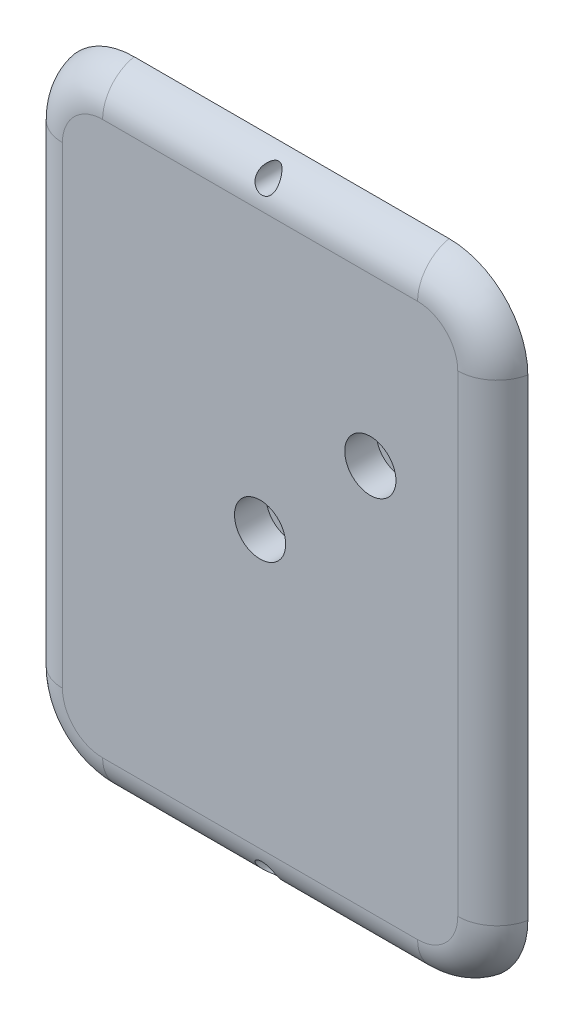
ISO-10303-21;
HEADER;
FILE_DESCRIPTION(('STEP AP214'),'2;1');
FILE_NAME('part.step','',(''),(''),'','','');
FILE_SCHEMA(('AUTOMOTIVE_DESIGN { 1 0 10303 214 1 1 1 1 }'));
ENDSEC;
DATA;
#1=APPLICATION_CONTEXT('core data for automotive mechanical design processes');
#2=APPLICATION_PROTOCOL_DEFINITION('international standard','automotive_design',2000,#1);
#3=PRODUCT_CONTEXT('',#1,'mechanical');
#4=PRODUCT('Part','Part','',(#3));
#5=PRODUCT_RELATED_PRODUCT_CATEGORY('part','',(#4));
#6=PRODUCT_DEFINITION_FORMATION('','',#4);
#7=PRODUCT_DEFINITION_CONTEXT('part definition',#1,'design');
#8=PRODUCT_DEFINITION('design','',#6,#7);
#9=PRODUCT_DEFINITION_SHAPE('','',#8);
#10=(LENGTH_UNIT() NAMED_UNIT(*) SI_UNIT(.MILLI.,.METRE.));
#11=(NAMED_UNIT(*) PLANE_ANGLE_UNIT() SI_UNIT($,.RADIAN.));
#12=(NAMED_UNIT(*) SI_UNIT($,.STERADIAN.) SOLID_ANGLE_UNIT());
#13=UNCERTAINTY_MEASURE_WITH_UNIT(LENGTH_MEASURE(1.E-05),#10,'distance_accuracy_value','');
#14=(GEOMETRIC_REPRESENTATION_CONTEXT(3) GLOBAL_UNCERTAINTY_ASSIGNED_CONTEXT((#13)) GLOBAL_UNIT_ASSIGNED_CONTEXT((#10,
#11,#12)) REPRESENTATION_CONTEXT('',''));
#15=CARTESIAN_POINT('',(0.,0.,0.));
#16=DIRECTION('',(0.,0.,1.));
#17=DIRECTION('',(1.,0.,0.));
#18=AXIS2_PLACEMENT_3D('',#15,#16,#17);
#19=CARTESIAN_POINT('',(20.,-30.,3.));
#20=DIRECTION('',(0.,0.,-1.));
#21=DIRECTION('',(-1.,0.,0.));
#22=AXIS2_PLACEMENT_3D('',#19,#20,#21);
#23=CYLINDRICAL_SURFACE('',#22,5.7);
#24=CARTESIAN_POINT('',(20.,-30.,0.));
#25=DIRECTION('',(0.,0.,1.));
#26=DIRECTION('',(1.,0.,0.));
#27=AXIS2_PLACEMENT_3D('',#24,#25,#26);
#28=CIRCLE('',#27,5.7);
#29=CARTESIAN_POINT('',(20.,-35.7,0.));
#30=VERTEX_POINT('',#29);
#31=CARTESIAN_POINT('',(25.7,-30.,0.));
#32=VERTEX_POINT('',#31);
#33=EDGE_CURVE('E429',#30,#32,#28,.T.);
#34=ORIENTED_EDGE('',*,*,#33,.T.);
#35=DIRECTION('',(0.,0.,-1.));
#36=VECTOR('',#35,1.);
#37=CARTESIAN_POINT('',(25.7,-30.,3.));
#38=LINE('',#37,#36);
#39=CARTESIAN_POINT('',(25.7,-30.,3.));
#40=VERTEX_POINT('',#39);
#41=EDGE_CURVE('E478',#40,#32,#38,.T.);
#42=ORIENTED_EDGE('',*,*,#41,.F.);
#43=CARTESIAN_POINT('',(20.,-30.,3.));
#44=DIRECTION('',(0.,0.,1.));
#45=DIRECTION('',(1.,0.,0.));
#46=AXIS2_PLACEMENT_3D('',#43,#44,#45);
#47=CIRCLE('',#46,5.7);
#48=CARTESIAN_POINT('',(20.,-35.7,3.));
#49=VERTEX_POINT('',#48);
#50=EDGE_CURVE('E457',#49,#40,#47,.T.);
#51=ORIENTED_EDGE('',*,*,#50,.F.);
#52=DIRECTION('',(0.,0.,-1.));
#53=VECTOR('',#52,1.);
#54=CARTESIAN_POINT('',(20.,-35.7,3.));
#55=LINE('',#54,#53);
#56=EDGE_CURVE('E458',#49,#30,#55,.T.);
#57=ORIENTED_EDGE('',*,*,#56,.T.);
#58=EDGE_LOOP('',(#34,#42,#51,#57));
#59=FACE_BOUND('',#58,.T.);
#60=ADVANCED_FACE('F33',(#59),#23,.T.);
#61=CARTESIAN_POINT('',(25.7,-30.,3.));
#62=DIRECTION('',(-1.,0.,0.));
#63=DIRECTION('',(0.,0.,1.));
#64=AXIS2_PLACEMENT_3D('',#61,#62,#63);
#65=PLANE('',#64);
#66=DIRECTION('',(0.,1.,0.));
#67=VECTOR('',#66,1.);
#68=CARTESIAN_POINT('',(25.7,-30.,0.));
#69=LINE('',#68,#67);
#70=CARTESIAN_POINT('',(25.7,30.,0.));
#71=VERTEX_POINT('',#70);
#72=EDGE_CURVE('E433',#32,#71,#69,.T.);
#73=ORIENTED_EDGE('',*,*,#72,.T.);
#74=DIRECTION('',(0.,0.,-1.));
#75=VECTOR('',#74,1.);
#76=CARTESIAN_POINT('',(25.7,30.,3.));
#77=LINE('',#76,#75);
#78=CARTESIAN_POINT('',(25.7,30.,3.));
#79=VERTEX_POINT('',#78);
#80=EDGE_CURVE('E475',#79,#71,#77,.T.);
#81=ORIENTED_EDGE('',*,*,#80,.F.);
#82=DIRECTION('',(0.,1.,0.));
#83=VECTOR('',#82,1.);
#84=CARTESIAN_POINT('',(25.7,-30.,3.));
#85=LINE('',#84,#83);
#86=EDGE_CURVE('E512',#40,#79,#85,.T.);
#87=ORIENTED_EDGE('',*,*,#86,.F.);
#88=ORIENTED_EDGE('',*,*,#41,.T.);
#89=EDGE_LOOP('',(#73,#81,#87,#88));
#90=FACE_BOUND('',#89,.T.);
#91=ADVANCED_FACE('F229',(#90),#65,.F.);
#92=CARTESIAN_POINT('',(20.,30.,3.));
#93=DIRECTION('',(0.,0.,-1.));
#94=DIRECTION('',(-1.,0.,0.));
#95=AXIS2_PLACEMENT_3D('',#92,#93,#94);
#96=CYLINDRICAL_SURFACE('',#95,5.7);
#97=CARTESIAN_POINT('',(20.,30.,0.));
#98=DIRECTION('',(0.,0.,1.));
#99=DIRECTION('',(1.,0.,0.));
#100=AXIS2_PLACEMENT_3D('',#97,#98,#99);
#101=CIRCLE('',#100,5.7);
#102=CARTESIAN_POINT('',(20.,35.7,0.));
#103=VERTEX_POINT('',#102);
#104=EDGE_CURVE('E439',#71,#103,#101,.T.);
#105=ORIENTED_EDGE('',*,*,#104,.T.);
#106=DIRECTION('',(0.,0.,-1.));
#107=VECTOR('',#106,1.);
#108=CARTESIAN_POINT('',(20.,35.7,3.));
#109=LINE('',#108,#107);
#110=CARTESIAN_POINT('',(20.,35.7,3.));
#111=VERTEX_POINT('',#110);
#112=EDGE_CURVE('E472',#111,#103,#109,.T.);
#113=ORIENTED_EDGE('',*,*,#112,.F.);
#114=CARTESIAN_POINT('',(20.,30.,3.));
#115=DIRECTION('',(0.,0.,1.));
#116=DIRECTION('',(1.,0.,0.));
#117=AXIS2_PLACEMENT_3D('',#114,#115,#116);
#118=CIRCLE('',#117,5.7);
#119=EDGE_CURVE('E515',#79,#111,#118,.T.);
#120=ORIENTED_EDGE('',*,*,#119,.F.);
#121=ORIENTED_EDGE('',*,*,#80,.T.);
#122=EDGE_LOOP('',(#105,#113,#120,#121));
#123=FACE_BOUND('',#122,.T.);
#124=ADVANCED_FACE('F235',(#123),#96,.T.);
#125=CARTESIAN_POINT('',(20.,35.7,3.));
#126=DIRECTION('',(0.,-1.,0.));
#127=DIRECTION('',(0.,0.,-1.));
#128=AXIS2_PLACEMENT_3D('',#125,#126,#127);
#129=PLANE('',#128);
#130=DIRECTION('',(-1.,0.,0.));
#131=VECTOR('',#130,1.);
#132=CARTESIAN_POINT('',(20.,35.7,0.));
#133=LINE('',#132,#131);
#134=CARTESIAN_POINT('',(-20.,35.7,0.));
#135=VERTEX_POINT('',#134);
#136=EDGE_CURVE('E448',#103,#135,#133,.T.);
#137=ORIENTED_EDGE('',*,*,#136,.T.);
#138=DIRECTION('',(0.,0.,-1.));
#139=VECTOR('',#138,1.);
#140=CARTESIAN_POINT('',(-20.,35.7,3.));
#141=LINE('',#140,#139);
#142=CARTESIAN_POINT('',(-20.,35.7,3.));
#143=VERTEX_POINT('',#142);
#144=EDGE_CURVE('E469',#143,#135,#141,.T.);
#145=ORIENTED_EDGE('',*,*,#144,.F.);
#146=DIRECTION('',(-1.,0.,0.));
#147=VECTOR('',#146,1.);
#148=CARTESIAN_POINT('',(20.,35.7,3.));
#149=LINE('',#148,#147);
#150=EDGE_CURVE('E518',#111,#143,#149,.T.);
#151=ORIENTED_EDGE('',*,*,#150,.F.);
#152=ORIENTED_EDGE('',*,*,#112,.T.);
#153=EDGE_LOOP('',(#137,#145,#151,#152));
#154=FACE_BOUND('',#153,.T.);
#155=ADVANCED_FACE('F387',(#154),#129,.F.);
#156=CARTESIAN_POINT('',(-20.,30.,3.));
#157=DIRECTION('',(0.,0.,-1.));
#158=DIRECTION('',(-1.,0.,0.));
#159=AXIS2_PLACEMENT_3D('',#156,#157,#158);
#160=CYLINDRICAL_SURFACE('',#159,5.7);
#161=CARTESIAN_POINT('',(-20.,30.,0.));
#162=DIRECTION('',(0.,0.,1.));
#163=DIRECTION('',(1.,0.,0.));
#164=AXIS2_PLACEMENT_3D('',#161,#162,#163);
#165=CIRCLE('',#164,5.7);
#166=CARTESIAN_POINT('',(-25.7,30.,0.));
#167=VERTEX_POINT('',#166);
#168=EDGE_CURVE('E450',#135,#167,#165,.T.);
#169=ORIENTED_EDGE('',*,*,#168,.T.);
#170=DIRECTION('',(0.,0.,-1.));
#171=VECTOR('',#170,1.);
#172=CARTESIAN_POINT('',(-25.7,30.,3.));
#173=LINE('',#172,#171);
#174=CARTESIAN_POINT('',(-25.7,30.,3.));
#175=VERTEX_POINT('',#174);
#176=EDGE_CURVE('E466',#175,#167,#173,.T.);
#177=ORIENTED_EDGE('',*,*,#176,.F.);
#178=CARTESIAN_POINT('',(-20.,30.,3.));
#179=DIRECTION('',(0.,0.,1.));
#180=DIRECTION('',(1.,0.,0.));
#181=AXIS2_PLACEMENT_3D('',#178,#179,#180);
#182=CIRCLE('',#181,5.7);
#183=EDGE_CURVE('E521',#143,#175,#182,.T.);
#184=ORIENTED_EDGE('',*,*,#183,.F.);
#185=ORIENTED_EDGE('',*,*,#144,.T.);
#186=EDGE_LOOP('',(#169,#177,#184,#185));
#187=FACE_BOUND('',#186,.T.);
#188=ADVANCED_FACE('F377',(#187),#160,.T.);
#189=CARTESIAN_POINT('',(-25.7,30.,3.));
#190=DIRECTION('',(1.,0.,0.));
#191=DIRECTION('',(0.,0.,-1.));
#192=AXIS2_PLACEMENT_3D('',#189,#190,#191);
#193=PLANE('',#192);
#194=DIRECTION('',(0.,-1.,0.));
#195=VECTOR('',#194,1.);
#196=CARTESIAN_POINT('',(-25.7,30.,0.));
#197=LINE('',#196,#195);
#198=CARTESIAN_POINT('',(-25.7,-30.,0.));
#199=VERTEX_POINT('',#198);
#200=EDGE_CURVE('E452',#167,#199,#197,.T.);
#201=ORIENTED_EDGE('',*,*,#200,.T.);
#202=DIRECTION('',(0.,0.,-1.));
#203=VECTOR('',#202,1.);
#204=CARTESIAN_POINT('',(-25.7,-30.,3.));
#205=LINE('',#204,#203);
#206=CARTESIAN_POINT('',(-25.7,-30.,3.));
#207=VERTEX_POINT('',#206);
#208=EDGE_CURVE('E463',#207,#199,#205,.T.);
#209=ORIENTED_EDGE('',*,*,#208,.F.);
#210=DIRECTION('',(0.,-1.,0.));
#211=VECTOR('',#210,1.);
#212=CARTESIAN_POINT('',(-25.7,30.,3.));
#213=LINE('',#212,#211);
#214=EDGE_CURVE('E524',#175,#207,#213,.T.);
#215=ORIENTED_EDGE('',*,*,#214,.F.);
#216=ORIENTED_EDGE('',*,*,#176,.T.);
#217=EDGE_LOOP('',(#201,#209,#215,#216));
#218=FACE_BOUND('',#217,.T.);
#219=ADVANCED_FACE('F367',(#218),#193,.F.);
#220=CARTESIAN_POINT('',(-20.,-30.,3.));
#221=DIRECTION('',(0.,0.,-1.));
#222=DIRECTION('',(-1.,0.,0.));
#223=AXIS2_PLACEMENT_3D('',#220,#221,#222);
#224=CYLINDRICAL_SURFACE('',#223,5.7);
#225=CARTESIAN_POINT('',(-20.,-30.,0.));
#226=DIRECTION('',(0.,0.,1.));
#227=DIRECTION('',(1.,0.,0.));
#228=AXIS2_PLACEMENT_3D('',#225,#226,#227);
#229=CIRCLE('',#228,5.7);
#230=CARTESIAN_POINT('',(-20.,-35.7,0.));
#231=VERTEX_POINT('',#230);
#232=EDGE_CURVE('E454',#199,#231,#229,.T.);
#233=ORIENTED_EDGE('',*,*,#232,.T.);
#234=DIRECTION('',(0.,0.,-1.));
#235=VECTOR('',#234,1.);
#236=CARTESIAN_POINT('',(-20.,-35.7,3.));
#237=LINE('',#236,#235);
#238=CARTESIAN_POINT('',(-20.,-35.7,3.));
#239=VERTEX_POINT('',#238);
#240=EDGE_CURVE('E460',#239,#231,#237,.T.);
#241=ORIENTED_EDGE('',*,*,#240,.F.);
#242=CARTESIAN_POINT('',(-20.,-30.,3.));
#243=DIRECTION('',(0.,0.,1.));
#244=DIRECTION('',(1.,0.,0.));
#245=AXIS2_PLACEMENT_3D('',#242,#243,#244);
#246=CIRCLE('',#245,5.7);
#247=EDGE_CURVE('E526',#207,#239,#246,.T.);
#248=ORIENTED_EDGE('',*,*,#247,.F.);
#249=ORIENTED_EDGE('',*,*,#208,.T.);
#250=EDGE_LOOP('',(#233,#241,#248,#249));
#251=FACE_BOUND('',#250,.T.);
#252=ADVANCED_FACE('F357',(#251),#224,.T.);
#253=CARTESIAN_POINT('',(-20.,-35.7,3.));
#254=DIRECTION('',(0.,1.,0.));
#255=DIRECTION('',(0.,0.,1.));
#256=AXIS2_PLACEMENT_3D('',#253,#254,#255);
#257=PLANE('',#256);
#258=DIRECTION('',(1.,0.,0.));
#259=VECTOR('',#258,1.);
#260=CARTESIAN_POINT('',(-20.,-35.7,0.));
#261=LINE('',#260,#259);
#262=EDGE_CURVE('E431',#231,#30,#261,.T.);
#263=ORIENTED_EDGE('',*,*,#262,.T.);
#264=ORIENTED_EDGE('',*,*,#56,.F.);
#265=DIRECTION('',(1.,0.,0.));
#266=VECTOR('',#265,1.);
#267=CARTESIAN_POINT('',(-20.,-35.7,3.));
#268=LINE('',#267,#266);
#269=EDGE_CURVE('E444',#239,#49,#268,.T.);
#270=ORIENTED_EDGE('',*,*,#269,.F.);
#271=ORIENTED_EDGE('',*,*,#240,.T.);
#272=EDGE_LOOP('',(#263,#264,#270,#271));
#273=FACE_BOUND('',#272,.T.);
#274=ADVANCED_FACE('F352',(#273),#257,.F.);
#275=CARTESIAN_POINT('',(20.,-30.,0.));
#276=DIRECTION('',(0.,0.,1.));
#277=DIRECTION('',(1.,0.,0.));
#278=AXIS2_PLACEMENT_3D('',#275,#276,#277);
#279=PLANE('',#278);
#280=ORIENTED_EDGE('',*,*,#33,.F.);
#281=ORIENTED_EDGE('',*,*,#262,.F.);
#282=ORIENTED_EDGE('',*,*,#232,.F.);
#283=ORIENTED_EDGE('',*,*,#200,.F.);
#284=ORIENTED_EDGE('',*,*,#168,.F.);
#285=ORIENTED_EDGE('',*,*,#136,.F.);
#286=ORIENTED_EDGE('',*,*,#104,.F.);
#287=ORIENTED_EDGE('',*,*,#72,.F.);
#288=EDGE_LOOP('',(#280,#281,#282,#283,#284,#285,#286,#287));
#289=FACE_BOUND('',#288,.T.);
#290=ADVANCED_FACE('F312',(#289),#279,.F.);
#291=CARTESIAN_POINT('',(20.,-30.,3.));
#292=DIRECTION('',(0.,0.,1.));
#293=DIRECTION('',(1.,0.,0.));
#294=AXIS2_PLACEMENT_3D('',#291,#292,#293);
#295=PLANE('',#294);
#296=CARTESIAN_POINT('',(0.,-38.,3.));
#297=DIRECTION('',(0.,0.,1.));
#298=DIRECTION('',(1.,0.,0.));
#299=AXIS2_PLACEMENT_3D('',#296,#297,#298);
#300=CIRCLE('',#299,1.35);
#301=CARTESIAN_POINT('',(1.35,-38.,3.));
#302=VERTEX_POINT('',#301);
#303=EDGE_CURVE('E198',#302,#302,#300,.T.);
#304=ORIENTED_EDGE('',*,*,#303,.T.);
#305=EDGE_LOOP('',(#304));
#306=FACE_BOUND('',#305,.T.);
#307=CARTESIAN_POINT('',(0.,38.,3.));
#308=DIRECTION('',(0.,0.,1.));
#309=DIRECTION('',(1.,0.,0.));
#310=AXIS2_PLACEMENT_3D('',#307,#308,#309);
#311=CIRCLE('',#310,1.35);
#312=CARTESIAN_POINT('',(1.35,38.,3.));
#313=VERTEX_POINT('',#312);
#314=EDGE_CURVE('E197',#313,#313,#311,.T.);
#315=ORIENTED_EDGE('',*,*,#314,.T.);
#316=EDGE_LOOP('',(#315));
#317=FACE_BOUND('',#316,.T.);
#318=CARTESIAN_POINT('',(20.,-30.,3.));
#319=DIRECTION('',(0.,0.,1.));
#320=DIRECTION('',(1.,0.,0.));
#321=AXIS2_PLACEMENT_3D('',#318,#319,#320);
#322=CIRCLE('',#321,10.);
#323=CARTESIAN_POINT('',(20.,-40.,3.));
#324=VERTEX_POINT('',#323);
#325=CARTESIAN_POINT('',(30.,-30.,3.));
#326=VERTEX_POINT('',#325);
#327=EDGE_CURVE('E156',#324,#326,#322,.T.);
#328=ORIENTED_EDGE('',*,*,#327,.F.);
#329=DIRECTION('',(1.,0.,0.));
#330=VECTOR('',#329,1.);
#331=CARTESIAN_POINT('',(-20.,-40.,3.));
#332=LINE('',#331,#330);
#333=CARTESIAN_POINT('',(-20.,-40.,3.));
#334=VERTEX_POINT('',#333);
#335=EDGE_CURVE('E437',#334,#324,#332,.T.);
#336=ORIENTED_EDGE('',*,*,#335,.F.);
#337=CARTESIAN_POINT('',(-20.,-30.,3.));
#338=DIRECTION('',(0.,0.,1.));
#339=DIRECTION('',(1.,0.,0.));
#340=AXIS2_PLACEMENT_3D('',#337,#338,#339);
#341=CIRCLE('',#340,10.);
#342=CARTESIAN_POINT('',(-30.,-30.,3.));
#343=VERTEX_POINT('',#342);
#344=EDGE_CURVE('E441',#343,#334,#341,.T.);
#345=ORIENTED_EDGE('',*,*,#344,.F.);
#346=DIRECTION('',(0.,-1.,0.));
#347=VECTOR('',#346,1.);
#348=CARTESIAN_POINT('',(-30.,30.,3.));
#349=LINE('',#348,#347);
#350=CARTESIAN_POINT('',(-30.,30.,3.));
#351=VERTEX_POINT('',#350);
#352=EDGE_CURVE('E505',#351,#343,#349,.T.);
#353=ORIENTED_EDGE('',*,*,#352,.F.);
#354=CARTESIAN_POINT('',(-20.,30.,3.));
#355=DIRECTION('',(0.,0.,1.));
#356=DIRECTION('',(1.,0.,0.));
#357=AXIS2_PLACEMENT_3D('',#354,#355,#356);
#358=CIRCLE('',#357,10.);
#359=CARTESIAN_POINT('',(-20.,40.,3.));
#360=VERTEX_POINT('',#359);
#361=EDGE_CURVE('E500',#360,#351,#358,.T.);
#362=ORIENTED_EDGE('',*,*,#361,.F.);
#363=DIRECTION('',(-1.,0.,0.));
#364=VECTOR('',#363,1.);
#365=CARTESIAN_POINT('',(20.,40.,3.));
#366=LINE('',#365,#364);
#367=CARTESIAN_POINT('',(20.,40.,3.));
#368=VERTEX_POINT('',#367);
#369=EDGE_CURVE('E498',#368,#360,#366,.T.);
#370=ORIENTED_EDGE('',*,*,#369,.F.);
#371=CARTESIAN_POINT('',(20.,30.,3.));
#372=DIRECTION('',(0.,0.,1.));
#373=DIRECTION('',(1.,0.,0.));
#374=AXIS2_PLACEMENT_3D('',#371,#372,#373);
#375=CIRCLE('',#374,10.);
#376=CARTESIAN_POINT('',(30.,30.,3.));
#377=VERTEX_POINT('',#376);
#378=EDGE_CURVE('E158',#377,#368,#375,.T.);
#379=ORIENTED_EDGE('',*,*,#378,.F.);
#380=DIRECTION('',(0.,1.,0.));
#381=VECTOR('',#380,1.);
#382=CARTESIAN_POINT('',(30.,-30.,3.));
#383=LINE('',#382,#381);
#384=EDGE_CURVE('E153',#326,#377,#383,.T.);
#385=ORIENTED_EDGE('',*,*,#384,.F.);
#386=EDGE_LOOP('',(#328,#336,#345,#353,#362,#370,#379,#385));
#387=FACE_BOUND('',#386,.T.);
#388=ORIENTED_EDGE('',*,*,#269,.T.);
#389=ORIENTED_EDGE('',*,*,#50,.T.);
#390=ORIENTED_EDGE('',*,*,#86,.T.);
#391=ORIENTED_EDGE('',*,*,#119,.T.);
#392=ORIENTED_EDGE('',*,*,#150,.T.);
#393=ORIENTED_EDGE('',*,*,#183,.T.);
#394=ORIENTED_EDGE('',*,*,#214,.T.);
#395=ORIENTED_EDGE('',*,*,#247,.T.);
#396=EDGE_LOOP('',(#388,#389,#390,#391,#392,#393,#394,#395));
#397=FACE_BOUND('',#396,.T.);
#398=ADVANCED_FACE('F154',(#306,#317,#387,#397),#295,.F.);
#399=CARTESIAN_POINT('',(20.,-30.,7.));
#400=DIRECTION('',(0.,0.,1.));
#401=DIRECTION('',(1.,0.,0.));
#402=AXIS2_PLACEMENT_3D('',#399,#400,#401);
#403=PLANE('',#402);
#404=DIRECTION('',(-1.,0.,0.));
#405=VECTOR('',#404,1.);
#406=CARTESIAN_POINT('',(20.,-35.1010205144336,7.));
#407=LINE('',#406,#405);
#408=CARTESIAN_POINT('',(-20.,-35.1010205144336,7.));
#409=VERTEX_POINT('',#408);
#410=CARTESIAN_POINT('',(20.,-35.1010205144336,7.));
#411=VERTEX_POINT('',#410);
#412=EDGE_CURVE('E480',#409,#411,#407,.F.);
#413=ORIENTED_EDGE('',*,*,#412,.T.);
#414=CARTESIAN_POINT('',(20.,-30.,7.));
#415=DIRECTION('',(0.,0.,1.));
#416=DIRECTION('',(1.,0.,0.));
#417=AXIS2_PLACEMENT_3D('',#414,#415,#416);
#418=CIRCLE('',#417,5.10102051443364);
#419=CARTESIAN_POINT('',(25.1010205144336,-30.,7.));
#420=VERTEX_POINT('',#419);
#421=EDGE_CURVE('E11',#411,#420,#418,.T.);
#422=ORIENTED_EDGE('',*,*,#421,.T.);
#423=DIRECTION('',(0.,-1.,0.));
#424=VECTOR('',#423,1.);
#425=CARTESIAN_POINT('',(25.1010205144336,30.,7.));
#426=LINE('',#425,#424);
#427=CARTESIAN_POINT('',(25.1010205144336,30.,7.));
#428=VERTEX_POINT('',#427);
#429=EDGE_CURVE('E47',#420,#428,#426,.F.);
#430=ORIENTED_EDGE('',*,*,#429,.T.);
#431=CARTESIAN_POINT('',(20.,30.,7.));
#432=DIRECTION('',(0.,0.,1.));
#433=DIRECTION('',(1.,0.,0.));
#434=AXIS2_PLACEMENT_3D('',#431,#432,#433);
#435=CIRCLE('',#434,5.10102051443364);
#436=CARTESIAN_POINT('',(20.,35.1010205144336,7.));
#437=VERTEX_POINT('',#436);
#438=EDGE_CURVE('E490',#428,#437,#435,.T.);
#439=ORIENTED_EDGE('',*,*,#438,.T.);
#440=DIRECTION('',(1.,0.,0.));
#441=VECTOR('',#440,1.);
#442=CARTESIAN_POINT('',(-20.,35.1010205144336,7.));
#443=LINE('',#442,#441);
#444=CARTESIAN_POINT('',(-20.,35.1010205144336,7.));
#445=VERTEX_POINT('',#444);
#446=EDGE_CURVE('E488',#437,#445,#443,.F.);
#447=ORIENTED_EDGE('',*,*,#446,.T.);
#448=CARTESIAN_POINT('',(-20.,30.,7.));
#449=DIRECTION('',(0.,0.,1.));
#450=DIRECTION('',(1.,0.,0.));
#451=AXIS2_PLACEMENT_3D('',#448,#449,#450);
#452=CIRCLE('',#451,5.10102051443364);
#453=CARTESIAN_POINT('',(-25.1010205144336,30.,7.));
#454=VERTEX_POINT('',#453);
#455=EDGE_CURVE('E486',#445,#454,#452,.T.);
#456=ORIENTED_EDGE('',*,*,#455,.T.);
#457=DIRECTION('',(0.,1.,0.));
#458=VECTOR('',#457,1.);
#459=CARTESIAN_POINT('',(-25.1010205144336,-30.,7.));
#460=LINE('',#459,#458);
#461=CARTESIAN_POINT('',(-25.1010205144336,-30.,7.));
#462=VERTEX_POINT('',#461);
#463=EDGE_CURVE('E484',#454,#462,#460,.F.);
#464=ORIENTED_EDGE('',*,*,#463,.T.);
#465=CARTESIAN_POINT('',(-20.,-30.,7.));
#466=DIRECTION('',(0.,0.,1.));
#467=DIRECTION('',(1.,0.,0.));
#468=AXIS2_PLACEMENT_3D('',#465,#466,#467);
#469=CIRCLE('',#468,5.10102051443364);
#470=EDGE_CURVE('E482',#462,#409,#469,.T.);
#471=ORIENTED_EDGE('',*,*,#470,.T.);
#472=EDGE_LOOP('',(#413,#422,#430,#439,#447,#456,#464,#471));
#473=FACE_BOUND('',#472,.T.);
#474=CARTESIAN_POINT('',(0.,0.,7.));
#475=DIRECTION('',(0.,0.,1.));
#476=DIRECTION('',(1.,0.,0.));
#477=AXIS2_PLACEMENT_3D('',#474,#475,#476);
#478=CIRCLE('',#477,3.25);
#479=CARTESIAN_POINT('',(3.25,0.,7.));
#480=VERTEX_POINT('',#479);
#481=EDGE_CURVE('E550',#480,#480,#478,.T.);
#482=ORIENTED_EDGE('',*,*,#481,.F.);
#483=EDGE_LOOP('',(#482));
#484=FACE_BOUND('',#483,.T.);
#485=CARTESIAN_POINT('',(14.,14.,7.));
#486=DIRECTION('',(0.,0.,1.));
#487=DIRECTION('',(1.,0.,0.));
#488=AXIS2_PLACEMENT_3D('',#485,#486,#487);
#489=CIRCLE('',#488,3.25);
#490=CARTESIAN_POINT('',(17.25,14.,7.));
#491=VERTEX_POINT('',#490);
#492=EDGE_CURVE('E564',#491,#491,#489,.T.);
#493=ORIENTED_EDGE('',*,*,#492,.F.);
#494=EDGE_LOOP('',(#493));
#495=FACE_BOUND('',#494,.T.);
#496=ADVANCED_FACE('F295',(#473,#484,#495),#403,.T.);
#497=CARTESIAN_POINT('',(0.,38.,7.));
#498=DIRECTION('',(0.,0.,-1.));
#499=DIRECTION('',(-1.,0.,0.));
#500=AXIS2_PLACEMENT_3D('',#497,#498,#499);
#501=CYLINDRICAL_SURFACE('',#500,1.35);
#502=CARTESIAN_POINT('',(-1.29522446520432,37.6193511004401,6.31949199091565));
#503=CARTESIAN_POINT('',(-1.27516240720157,37.5510832451305,6.35929614797901));
#504=CARTESIAN_POINT('',(-1.24931581611246,37.4831279398367,6.39672651435616));
#505=CARTESIAN_POINT('',(-1.18558189552019,37.350135953817,6.46621739748809));
#506=CARTESIAN_POINT('',(-1.14769843408164,37.2850983431375,6.49827963425153));
#507=CARTESIAN_POINT('',(-1.05986479208526,37.1603391140759,6.55675139432912));
#508=CARTESIAN_POINT('',(-1.00986131098131,37.1006426176664,6.58313494898185));
#509=CARTESIAN_POINT('',(-0.898863133370254,36.9897053203178,6.62995733190877));
#510=CARTESIAN_POINT('',(-0.837870650666671,36.9384628202438,6.65039735538074));
#511=CARTESIAN_POINT('',(-0.711602889662035,36.850391180654,6.68420410600012));
#512=CARTESIAN_POINT('',(-0.646989131220278,36.8127706702154,6.69798552641682));
#513=CARTESIAN_POINT('',(-0.511754551698244,36.7485179735808,6.7209027025419));
#514=CARTESIAN_POINT('',(-0.441135035694699,36.7218834074142,6.73003946455858));
#515=CARTESIAN_POINT('',(-0.298838530886498,36.6814943253592,6.743684397527));
#516=CARTESIAN_POINT('',(-0.227305744225878,36.6672853893954,6.74835650762605));
#517=CARTESIAN_POINT('',(-0.0827417709320308,36.6505754384922,6.7538362386546));
#518=CARTESIAN_POINT('',(-0.00971070688096597,36.648073469549,6.75464417447676));
#519=CARTESIAN_POINT('',(0.135142300145605,36.6548415746181,6.75243636390875));
#520=CARTESIAN_POINT('',(0.206969247225923,36.6640153642579,6.74945189200354));
#521=CARTESIAN_POINT('',(0.347982220228228,36.6936317318273,6.73960234731665));
#522=CARTESIAN_POINT('',(0.417168343309653,36.7140738947504,6.73273741744939));
#523=CARTESIAN_POINT('',(0.550996214623903,36.7654782501737,6.71490360443646));
#524=CARTESIAN_POINT('',(0.615635225654242,36.7964467148298,6.70393227407385));
#525=CARTESIAN_POINT('',(0.738560121522502,36.8677119032095,6.67763165802022));
#526=CARTESIAN_POINT('',(0.796846253883259,36.9080082633055,6.66230254220263));
#527=CARTESIAN_POINT('',(0.906209756254323,36.9968543168198,6.626890784648));
#528=CARTESIAN_POINT('',(0.957201453913253,37.0454893334025,6.60675806117498));
#529=CARTESIAN_POINT('',(1.05014549324573,37.1488090758019,6.5617685935246));
#530=CARTESIAN_POINT('',(1.0920969102451,37.2034944196042,6.53691136659603));
#531=CARTESIAN_POINT('',(1.16796466281368,37.3193022124394,6.48146306323529));
#532=CARTESIAN_POINT('',(1.20147057297632,37.3805983869247,6.45067534486786));
#533=CARTESIAN_POINT('',(1.25802557845958,37.5054542680513,6.38448368549581));
#534=CARTESIAN_POINT('',(1.28107100621283,37.5690147601781,6.34907813101626));
#535=CARTESIAN_POINT('',(1.31894162383654,37.7029886080163,6.27040770406358));
#536=CARTESIAN_POINT('',(1.3327026629124,37.7734462703934,6.22671027765358));
#537=CARTESIAN_POINT('',(1.34902311063828,37.9129506590693,6.13521775196539));
#538=CARTESIAN_POINT('',(1.35157700168361,37.9819966737269,6.08742064609929));
#539=CARTESIAN_POINT('',(1.34617252757019,38.1288174861658,5.98020594245517));
#540=CARTESIAN_POINT('',(1.33635727486084,38.2060859267631,5.92019257427501));
#541=CARTESIAN_POINT('',(1.30459454934032,38.355495303173,5.79707692165359));
#542=CARTESIAN_POINT('',(1.28263705015766,38.4276319458064,5.73397212378802));
#543=CARTESIAN_POINT('',(1.22217861290273,38.580406927651,5.59260796089799));
#544=CARTESIAN_POINT('',(1.18118073846528,38.6596755740125,5.51393546471245));
#545=CARTESIAN_POINT('',(1.08464123795382,38.8086741101216,5.35634535257337));
#546=CARTESIAN_POINT('',(1.02908986604609,38.8783975600551,5.27742760751372));
#547=CARTESIAN_POINT('',(0.917176282042229,38.9930836900514,5.13974983021374));
#548=CARTESIAN_POINT('',(0.863681614065511,39.0401190136815,5.08037499278458));
#549=CARTESIAN_POINT('',(0.746920976954941,39.1268972023269,4.9660429954202));
#550=CARTESIAN_POINT('',(0.683676336737031,39.1666555806952,4.91107658142047));
#551=CARTESIAN_POINT('',(0.572704166741172,39.2234120932318,4.82972173890465));
#552=CARTESIAN_POINT('',(0.528500035881776,39.2432502748685,4.80052954912952));
#553=CARTESIAN_POINT('',(0.435541076896274,39.2787776300071,4.74724643892362));
#554=CARTESIAN_POINT('',(0.386793292297627,39.2944730854061,4.72314780597172));
#555=CARTESIAN_POINT('',(0.295946890544962,39.3178050702222,4.68683701837886));
#556=CARTESIAN_POINT('',(0.254696384953901,39.3264509142203,4.67318072445476));
#557=CARTESIAN_POINT('',(0.170095107417013,39.3399234418324,4.65176634874328));
#558=CARTESIAN_POINT('',(0.126747432794497,39.3447555855673,4.64399983511198));
#559=CARTESIAN_POINT('',(0.0388028791141914,39.3501642876776,4.63530021136794));
#560=CARTESIAN_POINT('',(-0.00580012964876353,39.3507139655154,4.6344102649485));
#561=CARTESIAN_POINT('',(-0.0944229645708572,39.347425270317,4.63970722094295));
#562=CARTESIAN_POINT('',(-0.13844242033665,39.3435842337546,4.64589841897184));
#563=CARTESIAN_POINT('',(-0.230077826377712,39.3311540107825,4.66573059176908));
#564=CARTESIAN_POINT('',(-0.277428893641048,39.3220180273085,4.68022676303362));
#565=CARTESIAN_POINT('',(-0.368732897518822,39.2995225464037,4.71532950199926));
#566=CARTESIAN_POINT('',(-0.41267881574451,39.2861546003034,4.73594828770689));
#567=CARTESIAN_POINT('',(-0.520166646992115,39.2476988033274,4.79407103960642));
#568=CARTESIAN_POINT('',(-0.581174742896448,39.2202106783792,4.83462104387383));
#569=CARTESIAN_POINT('',(-0.695330058796834,39.1589773246049,4.92161622384196));
#570=CARTESIAN_POINT('',(-0.748455088178185,39.1252150133262,4.96807738198025));
#571=CARTESIAN_POINT('',(-0.837650495188439,39.0598313681158,5.05452753622045));
#572=CARTESIAN_POINT('',(-0.874998973101194,39.0291531708321,5.09393027152586));
#573=CARTESIAN_POINT('',(-0.945526688104737,38.9647591440385,5.17398340632831));
#574=CARTESIAN_POINT('',(-0.978703641202167,38.9310416676576,5.21463447428866));
#575=CARTESIAN_POINT('',(-1.0722674215056,38.8255868807949,5.33754656937319));
#576=CARTESIAN_POINT('',(-1.12668411003063,38.7495495118785,5.42076338512019));
#577=CARTESIAN_POINT('',(-1.22049140357099,38.5849066866417,5.58842105830694));
#578=CARTESIAN_POINT('',(-1.25942440117249,38.4960116077177,5.67283203940264));
#579=CARTESIAN_POINT('',(-1.31789904154198,38.308602579004,5.83756262277355));
#580=CARTESIAN_POINT('',(-1.33747466987566,38.2101058221207,5.91788915994645));
#581=CARTESIAN_POINT('',(-1.35198549041841,38.0293827727152,6.05394002070011));
#582=CARTESIAN_POINT('',(-1.35153773327557,37.9485975723414,6.1110851033666));
#583=CARTESIAN_POINT('',(-1.33527139661713,37.7848376946513,6.21980187922268));
#584=CARTESIAN_POINT('',(-1.31947336644068,37.7018660887226,6.27138092108954));
#585=CARTESIAN_POINT('',(-1.29522446520432,37.6193511004401,6.31949199091565));
#586=B_SPLINE_CURVE_WITH_KNOTS('',3,(#502,#503,#504,#505,#506,#507,#508,#509,#510,#511,#512,
#513,#514,#515,#516,#517,#518,#519,#520,#521,#522,#523,#524,#525,#526,#527,#528,#529,#530,#531,
#532,#533,#534,#535,#536,#537,#538,#539,#540,#541,#542,#543,#544,#545,#546,#547,#548,#549,#550,
#551,#552,#553,#554,#555,#556,#557,#558,#559,#560,#561,#562,#563,#564,#565,#566,#567,#568,#569,
#570,#571,#572,#573,#574,#575,#576,#577,#578,#579,#580,#581,#582,#583,#584,#585),.UNSPECIFIED.,
.T.,.F.,(4,2,2,2,2,2,2,2,2,2,2,2,2,2,2,2,2,2,2,2,2,2,2,2,2,2,2,2,2,2,2,2,2,2,2,2,2,2,2,2,2,4),
(0.,0.24431534247009,0.488552253143437,0.733883386427069,0.979165151360741,1.20610146181714,
1.4329885834404,1.65118207417944,1.86935778396577,2.08574590632973,2.30212605979728,
2.51863537127257,2.73513624402694,2.95400136387328,3.17288885945918,3.40094973399854,
3.62909050769812,3.88025259395034,4.13153832073395,4.42545421690505,4.71961317517644,
5.07519081175168,5.43100717431223,5.70853727462536,5.98546865018515,6.15476162995182,
6.32379640497669,6.45620316222193,6.58842000546777,6.72146609496427,6.85459293666753,
7.00482954967273,7.1553680061006,7.38879665568848,7.62287041864755,7.80970248865474,
7.99663641159318,8.37051886818674,8.75475023185696,9.13830579972076,9.43400374048648,
9.72930637640109),.UNSPECIFIED.);
#587=CARTESIAN_POINT('',(-1.29522446520432,37.6193511004401,6.31949199091565));
#588=VERTEX_POINT('',#587);
#589=EDGE_CURVE('E37',#588,#588,#586,.T.);
#590=ORIENTED_EDGE('',*,*,#589,.T.);
#591=EDGE_LOOP('',(#590));
#592=FACE_BOUND('',#591,.T.);
#593=ORIENTED_EDGE('',*,*,#314,.F.);
#594=EDGE_LOOP('',(#593));
#595=FACE_BOUND('',#594,.T.);
#596=ADVANCED_FACE('F284',(#592,#595),#501,.F.);
#597=CARTESIAN_POINT('',(0.,-38.,7.));
#598=DIRECTION('',(0.,0.,-1.));
#599=DIRECTION('',(-1.,0.,0.));
#600=AXIS2_PLACEMENT_3D('',#597,#598,#599);
#601=CYLINDRICAL_SURFACE('',#600,1.35);
#602=CARTESIAN_POINT('',(-1.29522446520432,-37.6193511004401,6.31949199091565));
#603=CARTESIAN_POINT('',(-1.32354690633646,-37.7157475648009,6.263281796846));
#604=CARTESIAN_POINT('',(-1.34036083718994,-37.812921800257,6.20223139301221));
#605=CARTESIAN_POINT('',(-1.35341491992491,-38.0038494233178,6.07271911370386));
#606=CARTESIAN_POINT('',(-1.34956535394086,-38.0975861112676,6.00422618551116));
#607=CARTESIAN_POINT('',(-1.32304210307902,-38.2861164433303,5.85625426410678));
#608=CARTESIAN_POINT('',(-1.29881419322803,-38.3803373351411,5.7763357321676));
#609=CARTESIAN_POINT('',(-1.2324341494446,-38.5592273915443,5.61323627622271));
#610=CARTESIAN_POINT('',(-1.19026491250002,-38.6438873442366,5.53005230822013));
#611=CARTESIAN_POINT('',(-1.11447292886349,-38.7633557205016,5.40451539011115));
#612=CARTESIAN_POINT('',(-1.08686682716451,-38.8021838853427,5.36222669008329));
#613=CARTESIAN_POINT('',(-1.02748931059321,-38.8769522386305,5.27803301465667));
#614=CARTESIAN_POINT('',(-0.995719653249144,-38.9128936353778,5.23612788528505));
#615=CARTESIAN_POINT('',(-0.928003496028572,-38.9816483283209,5.15335013548065));
#616=CARTESIAN_POINT('',(-0.892066607578758,-39.0144685169674,5.11247539375951));
#617=CARTESIAN_POINT('',(-0.815737092840137,-39.0768006015208,5.03244772733355));
#618=CARTESIAN_POINT('',(-0.775348420669743,-39.106315387078,4.99329331717027));
#619=CARTESIAN_POINT('',(-0.691546894815283,-39.1604494756899,4.91942464528004));
#620=CARTESIAN_POINT('',(-0.648342618850651,-39.1852260962541,4.88459123249031));
#621=CARTESIAN_POINT('',(-0.556994806742783,-39.2307957782335,4.8189619308555));
#622=CARTESIAN_POINT('',(-0.508855254050494,-39.2515920140976,4.78816283079291));
#623=CARTESIAN_POINT('',(-0.416034000878383,-39.2850725095987,4.73760246739181));
#624=CARTESIAN_POINT('',(-0.37218370032382,-39.2985369382582,4.71685379018472));
#625=CARTESIAN_POINT('',(-0.281056144907896,-39.3212488832733,4.68143969838767));
#626=CARTESIAN_POINT('',(-0.233785813239101,-39.3305046569059,4.66676237710297));
#627=CARTESIAN_POINT('',(-0.145601259554959,-39.3427227992869,4.64727610156522));
#628=CARTESIAN_POINT('',(-0.105098145225568,-39.3465245546251,4.64115638598574));
#629=CARTESIAN_POINT('',(-0.0234599866324811,-39.3504131182313,4.63489621092473));
#630=CARTESIAN_POINT('',(0.0176746274005701,-39.3505023524154,4.63475184689985));
#631=CARTESIAN_POINT('',(0.0992939134264824,-39.3469628204344,4.64045133581113));
#632=CARTESIAN_POINT('',(0.139779366205989,-39.3433389243791,4.64628734494235));
#633=CARTESIAN_POINT('',(0.219154865569075,-39.332696618788,4.66327167534399));
#634=CARTESIAN_POINT('',(0.258043186134827,-39.3256746365011,4.67442558768018));
#635=CARTESIAN_POINT('',(0.350635180035356,-39.3048795223266,4.70704373344348));
#636=CARTESIAN_POINT('',(0.403127872405019,-39.2894902604887,4.73088898431741));
#637=CARTESIAN_POINT('',(0.503080621147913,-39.2538906080097,4.78472972248886));
#638=CARTESIAN_POINT('',(0.550525952864926,-39.2336666418633,4.81474249381781));
#639=CARTESIAN_POINT('',(0.669913293999877,-39.1749850325676,4.89946312466587));
#640=CARTESIAN_POINT('',(0.73778666169413,-39.1332084073916,4.95756323547323));
#641=CARTESIAN_POINT('',(0.862533802763595,-39.0414121128123,5.07882447027072));
#642=CARTESIAN_POINT('',(0.9193796813712,-38.9913721170444,5.14199787170791));
#643=CARTESIAN_POINT('',(1.00642653585857,-38.901205024252,5.24990006466113));
#644=CARTESIAN_POINT('',(1.03934206686899,-38.8630089198157,5.29408301846472));
#645=CARTESIAN_POINT('',(1.10056139307085,-38.7834458123527,5.38279534061648));
#646=CARTESIAN_POINT('',(1.12886351490027,-38.742077666737,5.4273248285497));
#647=CARTESIAN_POINT('',(1.20671600500238,-38.6134944099746,5.56057314308084));
#648=CARTESIAN_POINT('',(1.24933089335075,-38.5216770823137,5.64910197679442));
#649=CARTESIAN_POINT('',(1.30818503676546,-38.3440132040102,5.80718725966613));
#650=CARTESIAN_POINT('',(1.32768253124801,-38.2598178300595,5.87740492669137));
#651=CARTESIAN_POINT('',(1.35013563958385,-38.0855659093685,6.01305390395875));
#652=CARTESIAN_POINT('',(1.35311740280835,-37.9955188564719,6.07849261848912));
#653=CARTESIAN_POINT('',(1.34124941632019,-37.8293159973852,6.19100591426354));
#654=CARTESIAN_POINT('',(1.32962851565454,-37.7537097570429,6.23922676399836));
#655=CARTESIAN_POINT('',(1.29249975865473,-37.6025175163963,6.33015852139476));
#656=CARTESIAN_POINT('',(1.26699636577325,-37.5269315173947,6.37287119457025));
#657=CARTESIAN_POINT('',(1.20106294865364,-37.3782244389106,6.45213364207486));
#658=CARTESIAN_POINT('',(1.16052835899698,-37.3051246395481,6.48863756618284));
#659=CARTESIAN_POINT('',(1.06467264522908,-37.165666247226,6.55446890469667));
#660=CARTESIAN_POINT('',(1.00936116532707,-37.0993032962743,6.58380097601875));
#661=CARTESIAN_POINT('',(0.893095712956488,-36.984770488692,6.63194012493669));
#662=CARTESIAN_POINT('',(0.833710227399899,-36.9353635043654,6.6516043381711));
#663=CARTESIAN_POINT('',(0.706308953651672,-36.8469032094334,6.68552498823104));
#664=CARTESIAN_POINT('',(0.638296667605428,-36.8078457171023,6.69978361019878));
#665=CARTESIAN_POINT('',(0.500852986275371,-36.7442229693563,6.72238810853802));
#666=CARTESIAN_POINT('',(0.431859751231509,-36.7188300755527,6.73107999113229));
#667=CARTESIAN_POINT('',(0.290298265676037,-36.679538167349,6.74433516330026));
#668=CARTESIAN_POINT('',(0.217730580060767,-36.6656373429099,6.74889910304933));
#669=CARTESIAN_POINT('',(0.0725389129883871,-36.6500106969373,6.75401894307381));
#670=CARTESIAN_POINT('',(-5.86260078398092E-05,-36.6480620068944,6.75464821646846));
#671=CARTESIAN_POINT('',(-0.144562047167238,-36.6558139490477,6.75211885186744));
#672=CARTESIAN_POINT('',(-0.216467950140494,-36.6655142296352,6.74896032820142));
#673=CARTESIAN_POINT('',(-0.357362751822311,-36.6961684358876,6.73875092083999));
#674=CARTESIAN_POINT('',(-0.426358444337242,-36.7170943845274,6.7317097125022));
#675=CARTESIAN_POINT('',(-0.559679301212182,-36.7693962034219,6.71352141798402));
#676=CARTESIAN_POINT('',(-0.624004900850234,-36.800771098251,6.70237471504769));
#677=CARTESIAN_POINT('',(-0.74651877284379,-36.8729303490085,6.67566206840399));
#678=CARTESIAN_POINT('',(-0.804678751172543,-36.913755559696,6.66007686719074));
#679=CARTESIAN_POINT('',(-0.913095251560239,-37.0031571938916,6.6243039991731));
#680=CARTESIAN_POINT('',(-0.963349719534611,-37.0517356253312,6.60411513952942));
#681=CARTESIAN_POINT('',(-1.05601500326413,-37.156011890296,6.55854370770684));
#682=CARTESIAN_POINT('',(-1.09820847691257,-37.211852677313,6.53304805430335));
#683=CARTESIAN_POINT('',(-1.17263553444491,-37.3275763769749,6.47733846081271));
#684=CARTESIAN_POINT('',(-1.20487815473237,-37.3874555617549,6.44712883926118));
#685=CARTESIAN_POINT('',(-1.24475657726504,-37.4765138570938,6.39977911865168));
#686=CARTESIAN_POINT('',(-1.25630792543982,-37.5049097853097,6.38433325445546));
#687=CARTESIAN_POINT('',(-1.27732119062098,-37.5619645516876,6.35256533035063));
#688=CARTESIAN_POINT('',(-1.28678388808093,-37.5906232874644,6.33624360056513));
#689=CARTESIAN_POINT('',(-1.29522446520432,-37.6193511004401,6.31949199091565));
#690=B_SPLINE_CURVE_WITH_KNOTS('',3,(#602,#603,#604,#605,#606,#607,#608,#609,#610,#611,#612,
#613,#614,#615,#616,#617,#618,#619,#620,#621,#622,#623,#624,#625,#626,#627,#628,#629,#630,#631,
#632,#633,#634,#635,#636,#637,#638,#639,#640,#641,#642,#643,#644,#645,#646,#647,#648,#649,#650,
#651,#652,#653,#654,#655,#656,#657,#658,#659,#660,#661,#662,#663,#664,#665,#666,#667,#668,#669,
#670,#671,#672,#673,#674,#675,#676,#677,#678,#679,#680,#681,#682,#683,#684,#685,#686,#687,#688,
#689),.UNSPECIFIED.,.T.,.F.,(4,2,2,2,2,2,2,2,2,2,2,2,2,2,2,2,2,2,2,2,2,2,2,2,2,2,2,2,2,2,2,2,2,
2,2,2,2,2,2,2,2,2,2,4),(0.,0.345207192080235,0.691914432120652,1.06774816115967,
1.44394096854255,1.63488870373284,1.82575609376038,2.01619170398724,2.2064595100765,
2.38843320494993,2.57026116128817,2.72078710816954,2.87101643890238,2.99387446619052,
3.11665221166301,3.23926912877749,3.36201524646073,3.5400153849825,3.71852133055183,
4.01279559209955,4.30780480154543,4.50869150330531,4.70965090872852,5.11089495982311,
5.44372624299071,5.77603040314656,6.04622101052092,6.3163247983776,6.58834394865115,
6.86018599618778,7.09806268085167,7.33584310406752,7.55685838814866,7.77783885495241,
7.99468590754721,8.21152641506508,8.42782899840427,8.64411139521545,8.86134686842097,
9.07863869290596,9.30114865409956,9.52345595462005,9.62637218757829,9.7292498990972),.UNSPECIFIED.);
#691=CARTESIAN_POINT('',(-1.29522446520432,-37.6193511004401,6.31949199091565));
#692=VERTEX_POINT('',#691);
#693=EDGE_CURVE('E190',#692,#692,#690,.T.);
#694=ORIENTED_EDGE('',*,*,#693,.T.);
#695=EDGE_LOOP('',(#694));
#696=FACE_BOUND('',#695,.T.);
#697=ORIENTED_EDGE('',*,*,#303,.F.);
#698=EDGE_LOOP('',(#697));
#699=FACE_BOUND('',#698,.T.);
#700=ADVANCED_FACE('F199',(#696,#699),#601,.F.);
#701=CARTESIAN_POINT('',(0.,0.,7.));
#702=DIRECTION('',(0.,0.,-1.));
#703=DIRECTION('',(-1.,0.,0.));
#704=AXIS2_PLACEMENT_3D('',#701,#702,#703);
#705=CYLINDRICAL_SURFACE('',#704,3.25);
#706=ORIENTED_EDGE('',*,*,#481,.T.);
#707=EDGE_LOOP('',(#706));
#708=FACE_BOUND('',#707,.T.);
#709=CARTESIAN_POINT('',(0.,0.,3.));
#710=DIRECTION('',(0.,0.,1.));
#711=DIRECTION('',(1.,0.,0.));
#712=AXIS2_PLACEMENT_3D('',#709,#710,#711);
#713=CIRCLE('',#712,3.25);
#714=CARTESIAN_POINT('',(3.25,0.,3.));
#715=VERTEX_POINT('',#714);
#716=EDGE_CURVE('E553',#715,#715,#713,.T.);
#717=ORIENTED_EDGE('',*,*,#716,.F.);
#718=EDGE_LOOP('',(#717));
#719=FACE_BOUND('',#718,.T.);
#720=ADVANCED_FACE('F283',(#708,#719),#705,.F.);
#721=CARTESIAN_POINT('',(14.,14.,7.));
#722=DIRECTION('',(0.,0.,-1.));
#723=DIRECTION('',(-1.,0.,0.));
#724=AXIS2_PLACEMENT_3D('',#721,#722,#723);
#725=CYLINDRICAL_SURFACE('',#724,3.25);
#726=ORIENTED_EDGE('',*,*,#492,.T.);
#727=EDGE_LOOP('',(#726));
#728=FACE_BOUND('',#727,.T.);
#729=CARTESIAN_POINT('',(14.,14.,3.));
#730=DIRECTION('',(0.,0.,1.));
#731=DIRECTION('',(1.,0.,0.));
#732=AXIS2_PLACEMENT_3D('',#729,#730,#731);
#733=CIRCLE('',#732,3.25);
#734=CARTESIAN_POINT('',(17.25,14.,3.));
#735=VERTEX_POINT('',#734);
#736=EDGE_CURVE('E189',#735,#735,#733,.T.);
#737=ORIENTED_EDGE('',*,*,#736,.F.);
#738=EDGE_LOOP('',(#737));
#739=FACE_BOUND('',#738,.T.);
#740=ADVANCED_FACE('F333',(#728,#739),#725,.F.);
#741=CARTESIAN_POINT('',(20.,-30.,3.));
#742=DIRECTION('',(0.,0.,1.));
#743=DIRECTION('',(1.,0.,0.));
#744=AXIS2_PLACEMENT_3D('',#741,#742,#743);
#745=PLANE('',#744);
#746=ORIENTED_EDGE('',*,*,#716,.T.);
#747=EDGE_LOOP('',(#746));
#748=FACE_BOUND('',#747,.T.);
#749=ADVANCED_FACE('F323',(#748),#745,.T.);
#750=ORIENTED_EDGE('',*,*,#736,.T.);
#751=EDGE_LOOP('',(#750));
#752=FACE_BOUND('',#751,.T.);
#753=ADVANCED_FACE('F226',(#752),#745,.T.);
#754=CARTESIAN_POINT('',(-20.,30.,2.));
#755=DIRECTION('',(0.,0.,-1.));
#756=DIRECTION('',(-1.,0.,0.));
#757=AXIS2_PLACEMENT_3D('',#754,#755,#756);
#758=TOROIDAL_SURFACE('',#757,5.10102051443364,5.);
#759=CARTESIAN_POINT('',(-20.,35.1010205144336,2.));
#760=DIRECTION('',(1.,0.,0.));
#761=DIRECTION('',(0.,0.,-1.));
#762=AXIS2_PLACEMENT_3D('',#759,#760,#761);
#763=CIRCLE('',#762,5.);
#764=EDGE_CURVE('E184',#360,#445,#763,.T.);
#765=ORIENTED_EDGE('',*,*,#764,.F.);
#766=ORIENTED_EDGE('',*,*,#361,.T.);
#767=CARTESIAN_POINT('',(-25.1010205144336,30.,2.));
#768=DIRECTION('',(0.,-1.,0.));
#769=DIRECTION('',(0.,0.,-1.));
#770=AXIS2_PLACEMENT_3D('',#767,#768,#769);
#771=CIRCLE('',#770,5.);
#772=EDGE_CURVE('E187',#454,#351,#771,.T.);
#773=ORIENTED_EDGE('',*,*,#772,.F.);
#774=ORIENTED_EDGE('',*,*,#455,.F.);
#775=EDGE_LOOP('',(#765,#766,#773,#774));
#776=FACE_BOUND('',#775,.T.);
#777=ADVANCED_FACE('F35',(#776),#758,.T.);
#778=CARTESIAN_POINT('',(-25.1010205144336,30.,2.));
#779=DIRECTION('',(0.,-1.,0.));
#780=DIRECTION('',(0.,0.,-1.));
#781=AXIS2_PLACEMENT_3D('',#778,#779,#780);
#782=CYLINDRICAL_SURFACE('',#781,5.);
#783=ORIENTED_EDGE('',*,*,#772,.T.);
#784=ORIENTED_EDGE('',*,*,#352,.T.);
#785=CARTESIAN_POINT('',(-25.1010205144336,-30.,2.));
#786=DIRECTION('',(0.,-1.,0.));
#787=DIRECTION('',(0.,0.,-1.));
#788=AXIS2_PLACEMENT_3D('',#785,#786,#787);
#789=CIRCLE('',#788,5.);
#790=EDGE_CURVE('E181',#462,#343,#789,.T.);
#791=ORIENTED_EDGE('',*,*,#790,.F.);
#792=ORIENTED_EDGE('',*,*,#463,.F.);
#793=EDGE_LOOP('',(#783,#784,#791,#792));
#794=FACE_BOUND('',#793,.T.);
#795=ADVANCED_FACE('F219',(#794),#782,.T.);
#796=CARTESIAN_POINT('',(20.,35.1010205144336,2.));
#797=DIRECTION('',(-1.,0.,0.));
#798=DIRECTION('',(0.,0.,1.));
#799=AXIS2_PLACEMENT_3D('',#796,#797,#798);
#800=CYLINDRICAL_SURFACE('',#799,5.);
#801=ORIENTED_EDGE('',*,*,#764,.T.);
#802=ORIENTED_EDGE('',*,*,#446,.F.);
#803=CARTESIAN_POINT('',(20.,35.1010205144336,2.));
#804=DIRECTION('',(1.,0.,0.));
#805=DIRECTION('',(0.,0.,-1.));
#806=AXIS2_PLACEMENT_3D('',#803,#804,#805);
#807=CIRCLE('',#806,5.);
#808=EDGE_CURVE('E178',#368,#437,#807,.T.);
#809=ORIENTED_EDGE('',*,*,#808,.F.);
#810=ORIENTED_EDGE('',*,*,#369,.T.);
#811=EDGE_LOOP('',(#801,#802,#809,#810));
#812=FACE_BOUND('',#811,.T.);
#813=ORIENTED_EDGE('',*,*,#589,.F.);
#814=EDGE_LOOP('',(#813));
#815=FACE_BOUND('',#814,.T.);
#816=ADVANCED_FACE('F215',(#812,#815),#800,.T.);
#817=CARTESIAN_POINT('',(-20.,-30.,2.));
#818=DIRECTION('',(0.,0.,-1.));
#819=DIRECTION('',(-1.,0.,0.));
#820=AXIS2_PLACEMENT_3D('',#817,#818,#819);
#821=TOROIDAL_SURFACE('',#820,5.10102051443364,5.);
#822=ORIENTED_EDGE('',*,*,#790,.T.);
#823=ORIENTED_EDGE('',*,*,#344,.T.);
#824=CARTESIAN_POINT('',(-20.,-35.1010205144336,2.));
#825=DIRECTION('',(1.,0.,0.));
#826=DIRECTION('',(0.,0.,-1.));
#827=AXIS2_PLACEMENT_3D('',#824,#825,#826);
#828=CIRCLE('',#827,5.);
#829=EDGE_CURVE('E175',#409,#334,#828,.T.);
#830=ORIENTED_EDGE('',*,*,#829,.F.);
#831=ORIENTED_EDGE('',*,*,#470,.F.);
#832=EDGE_LOOP('',(#822,#823,#830,#831));
#833=FACE_BOUND('',#832,.T.);
#834=ADVANCED_FACE('F212',(#833),#821,.T.);
#835=CARTESIAN_POINT('',(20.,30.,2.));
#836=DIRECTION('',(0.,0.,-1.));
#837=DIRECTION('',(-1.,0.,0.));
#838=AXIS2_PLACEMENT_3D('',#835,#836,#837);
#839=TOROIDAL_SURFACE('',#838,5.10102051443364,5.);
#840=ORIENTED_EDGE('',*,*,#808,.T.);
#841=ORIENTED_EDGE('',*,*,#438,.F.);
#842=CARTESIAN_POINT('',(25.1010205144336,30.,2.));
#843=DIRECTION('',(0.,-1.,0.));
#844=DIRECTION('',(0.,0.,-1.));
#845=AXIS2_PLACEMENT_3D('',#842,#843,#844);
#846=CIRCLE('',#845,5.);
#847=EDGE_CURVE('E170',#377,#428,#846,.T.);
#848=ORIENTED_EDGE('',*,*,#847,.F.);
#849=ORIENTED_EDGE('',*,*,#378,.T.);
#850=EDGE_LOOP('',(#840,#841,#848,#849));
#851=FACE_BOUND('',#850,.T.);
#852=ADVANCED_FACE('F207',(#851),#839,.T.);
#853=CARTESIAN_POINT('',(-20.,-35.1010205144336,2.));
#854=DIRECTION('',(1.,0.,0.));
#855=DIRECTION('',(0.,0.,-1.));
#856=AXIS2_PLACEMENT_3D('',#853,#854,#855);
#857=CYLINDRICAL_SURFACE('',#856,5.);
#858=ORIENTED_EDGE('',*,*,#829,.T.);
#859=ORIENTED_EDGE('',*,*,#335,.T.);
#860=CARTESIAN_POINT('',(20.,-35.1010205144336,2.));
#861=DIRECTION('',(1.,0.,0.));
#862=DIRECTION('',(0.,0.,-1.));
#863=AXIS2_PLACEMENT_3D('',#860,#861,#862);
#864=CIRCLE('',#863,5.);
#865=EDGE_CURVE('E165',#411,#324,#864,.T.);
#866=ORIENTED_EDGE('',*,*,#865,.F.);
#867=ORIENTED_EDGE('',*,*,#412,.F.);
#868=EDGE_LOOP('',(#858,#859,#866,#867));
#869=FACE_BOUND('',#868,.T.);
#870=ORIENTED_EDGE('',*,*,#693,.F.);
#871=EDGE_LOOP('',(#870));
#872=FACE_BOUND('',#871,.T.);
#873=ADVANCED_FACE('F202',(#869,#872),#857,.T.);
#874=CARTESIAN_POINT('',(25.1010205144336,-30.,2.));
#875=DIRECTION('',(0.,1.,0.));
#876=DIRECTION('',(0.,0.,1.));
#877=AXIS2_PLACEMENT_3D('',#874,#875,#876);
#878=CYLINDRICAL_SURFACE('',#877,5.);
#879=ORIENTED_EDGE('',*,*,#847,.T.);
#880=ORIENTED_EDGE('',*,*,#429,.F.);
#881=CARTESIAN_POINT('',(25.1010205144336,-30.,2.));
#882=DIRECTION('',(0.,-1.,0.));
#883=DIRECTION('',(0.,0.,-1.));
#884=AXIS2_PLACEMENT_3D('',#881,#882,#883);
#885=CIRCLE('',#884,5.);
#886=EDGE_CURVE('E55',#326,#420,#885,.T.);
#887=ORIENTED_EDGE('',*,*,#886,.F.);
#888=ORIENTED_EDGE('',*,*,#384,.T.);
#889=EDGE_LOOP('',(#879,#880,#887,#888));
#890=FACE_BOUND('',#889,.T.);
#891=ADVANCED_FACE('F168',(#890),#878,.T.);
#892=CARTESIAN_POINT('',(20.,-30.,2.));
#893=DIRECTION('',(0.,0.,-1.));
#894=DIRECTION('',(-1.,0.,0.));
#895=AXIS2_PLACEMENT_3D('',#892,#893,#894);
#896=TOROIDAL_SURFACE('',#895,5.10102051443364,5.);
#897=ORIENTED_EDGE('',*,*,#865,.T.);
#898=ORIENTED_EDGE('',*,*,#327,.T.);
#899=ORIENTED_EDGE('',*,*,#886,.T.);
#900=ORIENTED_EDGE('',*,*,#421,.F.);
#901=EDGE_LOOP('',(#897,#898,#899,#900));
#902=FACE_BOUND('',#901,.T.);
#903=ADVANCED_FACE('F163',(#902),#896,.T.);
#904=CLOSED_SHELL('',(#60,#91,#124,#155,#188,#219,#252,#274,#290,#398,#496,#596,#700,#720,#740,
#749,#753,#777,#795,#816,#834,#852,#873,#891,#903));
#905=MANIFOLD_SOLID_BREP('B2',#904);
#906=ADVANCED_BREP_SHAPE_REPRESENTATION('',(#18,#905),#14);
#907=SHAPE_DEFINITION_REPRESENTATION(#9,#906);
ENDSEC;
END-ISO-10303-21;
